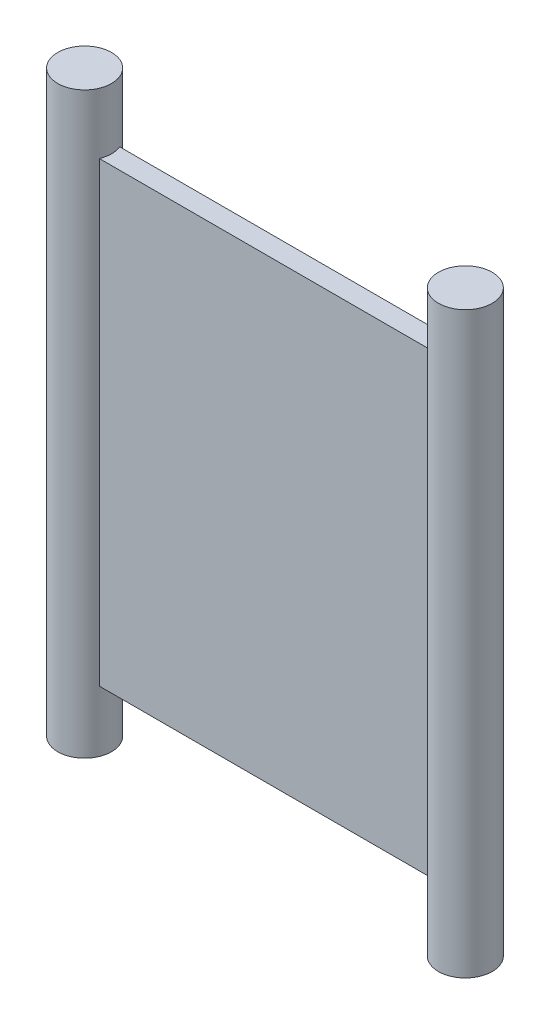
ISO-10303-21;
HEADER;
FILE_DESCRIPTION(('STEP AP214'),'2;1');
FILE_NAME('part.step','',(''),(''),'','','');
FILE_SCHEMA(('AUTOMOTIVE_DESIGN { 1 0 10303 214 1 1 1 1 }'));
ENDSEC;
DATA;
#1=APPLICATION_CONTEXT('core data for automotive mechanical design processes');
#2=APPLICATION_PROTOCOL_DEFINITION('international standard','automotive_design',2000,#1);
#3=PRODUCT_CONTEXT('',#1,'mechanical');
#4=PRODUCT('Part','Part','',(#3));
#5=PRODUCT_RELATED_PRODUCT_CATEGORY('part','',(#4));
#6=PRODUCT_DEFINITION_FORMATION('','',#4);
#7=PRODUCT_DEFINITION_CONTEXT('part definition',#1,'design');
#8=PRODUCT_DEFINITION('design','',#6,#7);
#9=PRODUCT_DEFINITION_SHAPE('','',#8);
#10=(LENGTH_UNIT() NAMED_UNIT(*) SI_UNIT(.MILLI.,.METRE.));
#11=(NAMED_UNIT(*) PLANE_ANGLE_UNIT() SI_UNIT($,.RADIAN.));
#12=(NAMED_UNIT(*) SI_UNIT($,.STERADIAN.) SOLID_ANGLE_UNIT());
#13=UNCERTAINTY_MEASURE_WITH_UNIT(LENGTH_MEASURE(1.E-05),#10,'distance_accuracy_value','');
#14=(GEOMETRIC_REPRESENTATION_CONTEXT(3) GLOBAL_UNCERTAINTY_ASSIGNED_CONTEXT((#13)) GLOBAL_UNIT_ASSIGNED_CONTEXT((#10,
#11,#12)) REPRESENTATION_CONTEXT('',''));
#15=CARTESIAN_POINT('',(0.,0.,0.));
#16=DIRECTION('',(0.,0.,1.));
#17=DIRECTION('',(1.,0.,0.));
#18=AXIS2_PLACEMENT_3D('',#15,#16,#17);
#19=CARTESIAN_POINT('',(9.373,22.5,0.499999999999999));
#20=DIRECTION('',(0.,0.,-1.));
#21=DIRECTION('',(-1.,0.,0.));
#22=AXIS2_PLACEMENT_3D('',#19,#20,#21);
#23=PLANE('',#22);
#24=DIRECTION('',(0.,-1.,0.));
#25=VECTOR('',#24,1.);
#26=CARTESIAN_POINT('',(8.1459608808192,25.5,0.499999999999999));
#27=LINE('',#26,#25);
#28=CARTESIAN_POINT('',(8.1459608808192,22.5,0.499999999999999));
#29=VERTEX_POINT('',#28);
#30=CARTESIAN_POINT('',(8.1459608808192,0.,0.499999999999999));
#31=VERTEX_POINT('',#30);
#32=EDGE_CURVE('E51',#29,#31,#27,.T.);
#33=ORIENTED_EDGE('',*,*,#32,.F.);
#34=DIRECTION('',(1.,0.,0.));
#35=VECTOR('',#34,1.);
#36=CARTESIAN_POINT('',(9.373,22.5,0.499999999999999));
#37=LINE('',#36,#35);
#38=CARTESIAN_POINT('',(-8.1459608808192,22.5,0.500000000000001));
#39=VERTEX_POINT('',#38);
#40=EDGE_CURVE('E88',#39,#29,#37,.T.);
#41=ORIENTED_EDGE('',*,*,#40,.F.);
#42=DIRECTION('',(0.,-1.,0.));
#43=VECTOR('',#42,1.);
#44=CARTESIAN_POINT('',(-8.1459608808192,25.5,0.500000000000001));
#45=LINE('',#44,#43);
#46=CARTESIAN_POINT('',(-8.1459608808192,0.,0.500000000000001));
#47=VERTEX_POINT('',#46);
#48=EDGE_CURVE('E101',#47,#39,#45,.F.);
#49=ORIENTED_EDGE('',*,*,#48,.F.);
#50=DIRECTION('',(1.,0.,0.));
#51=VECTOR('',#50,1.);
#52=CARTESIAN_POINT('',(9.373,0.,0.499999999999999));
#53=LINE('',#52,#51);
#54=EDGE_CURVE('E89',#47,#31,#53,.T.);
#55=ORIENTED_EDGE('',*,*,#54,.T.);
#56=EDGE_LOOP('',(#33,#41,#49,#55));
#57=FACE_BOUND('',#56,.T.);
#58=ADVANCED_FACE('F37',(#57),#23,.F.);
#59=CARTESIAN_POINT('',(9.373,22.5,-0.500000000000001));
#60=DIRECTION('',(0.,0.,1.));
#61=DIRECTION('',(1.,0.,0.));
#62=AXIS2_PLACEMENT_3D('',#59,#60,#61);
#63=PLANE('',#62);
#64=DIRECTION('',(0.,-1.,0.));
#65=VECTOR('',#64,1.);
#66=CARTESIAN_POINT('',(8.1459608808192,25.5,-0.500000000000001));
#67=LINE('',#66,#65);
#68=CARTESIAN_POINT('',(8.1459608808192,0.,-0.500000000000001));
#69=VERTEX_POINT('',#68);
#70=CARTESIAN_POINT('',(8.1459608808192,22.5,-0.500000000000001));
#71=VERTEX_POINT('',#70);
#72=EDGE_CURVE('E76',#69,#71,#67,.F.);
#73=ORIENTED_EDGE('',*,*,#72,.F.);
#74=DIRECTION('',(-1.,0.,0.));
#75=VECTOR('',#74,1.);
#76=CARTESIAN_POINT('',(9.373,0.,-0.500000000000001));
#77=LINE('',#76,#75);
#78=CARTESIAN_POINT('',(-8.14596088081919,0.,-0.499999999999999));
#79=VERTEX_POINT('',#78);
#80=EDGE_CURVE('E58',#69,#79,#77,.T.);
#81=ORIENTED_EDGE('',*,*,#80,.T.);
#82=DIRECTION('',(0.,-1.,0.));
#83=VECTOR('',#82,1.);
#84=CARTESIAN_POINT('',(-8.14596088081919,25.5,-0.499999999999999));
#85=LINE('',#84,#83);
#86=CARTESIAN_POINT('',(-8.14596088081919,22.5,-0.499999999999999));
#87=VERTEX_POINT('',#86);
#88=EDGE_CURVE('E103',#87,#79,#85,.T.);
#89=ORIENTED_EDGE('',*,*,#88,.F.);
#90=DIRECTION('',(-1.,0.,0.));
#91=VECTOR('',#90,1.);
#92=CARTESIAN_POINT('',(9.373,22.5,-0.500000000000001));
#93=LINE('',#92,#91);
#94=EDGE_CURVE('E83',#71,#87,#93,.T.);
#95=ORIENTED_EDGE('',*,*,#94,.F.);
#96=EDGE_LOOP('',(#73,#81,#89,#95));
#97=FACE_BOUND('',#96,.T.);
#98=ADVANCED_FACE('F82',(#97),#63,.F.);
#99=CARTESIAN_POINT('',(-9.373,25.5,0.));
#100=DIRECTION('',(0.,-1.,0.));
#101=DIRECTION('',(0.,0.,-1.));
#102=AXIS2_PLACEMENT_3D('',#99,#100,#101);
#103=CYLINDRICAL_SURFACE('',#102,1.325);
#104=CARTESIAN_POINT('',(-9.373,25.5,0.));
#105=DIRECTION('',(0.,1.,0.));
#106=DIRECTION('',(0.,0.,1.));
#107=AXIS2_PLACEMENT_3D('',#104,#105,#106);
#108=CIRCLE('',#107,1.325);
#109=CARTESIAN_POINT('',(-9.373,25.5,1.325));
#110=VERTEX_POINT('',#109);
#111=EDGE_CURVE('E105',#110,#110,#108,.T.);
#112=ORIENTED_EDGE('',*,*,#111,.F.);
#113=EDGE_LOOP('',(#112));
#114=FACE_BOUND('',#113,.T.);
#115=CARTESIAN_POINT('',(-9.373,-3.,0.));
#116=DIRECTION('',(0.,1.,0.));
#117=DIRECTION('',(0.,0.,1.));
#118=AXIS2_PLACEMENT_3D('',#115,#116,#117);
#119=CIRCLE('',#118,1.325);
#120=CARTESIAN_POINT('',(-9.373,-3.,1.325));
#121=VERTEX_POINT('',#120);
#122=EDGE_CURVE('E106',#121,#121,#119,.T.);
#123=ORIENTED_EDGE('',*,*,#122,.T.);
#124=EDGE_LOOP('',(#123));
#125=FACE_BOUND('',#124,.T.);
#126=ORIENTED_EDGE('',*,*,#48,.T.);
#127=CARTESIAN_POINT('',(-9.373,22.5,0.));
#128=DIRECTION('',(0.,-1.,0.));
#129=DIRECTION('',(0.,0.,-1.));
#130=AXIS2_PLACEMENT_3D('',#127,#128,#129);
#131=CIRCLE('',#130,1.325);
#132=EDGE_CURVE('E93',#39,#87,#131,.F.);
#133=ORIENTED_EDGE('',*,*,#132,.T.);
#134=ORIENTED_EDGE('',*,*,#88,.T.);
#135=CARTESIAN_POINT('',(-9.373,0.,0.));
#136=DIRECTION('',(0.,-1.,0.));
#137=DIRECTION('',(0.,0.,-1.));
#138=AXIS2_PLACEMENT_3D('',#135,#136,#137);
#139=CIRCLE('',#138,1.325);
#140=EDGE_CURVE('E44',#47,#79,#139,.F.);
#141=ORIENTED_EDGE('',*,*,#140,.F.);
#142=EDGE_LOOP('',(#126,#133,#134,#141));
#143=FACE_BOUND('',#142,.T.);
#144=ADVANCED_FACE('F136',(#114,#125,#143),#103,.T.);
#145=CARTESIAN_POINT('',(-9.373,25.5,0.));
#146=DIRECTION('',(0.,1.,0.));
#147=DIRECTION('',(0.,0.,1.));
#148=AXIS2_PLACEMENT_3D('',#145,#146,#147);
#149=PLANE('',#148);
#150=ORIENTED_EDGE('',*,*,#111,.T.);
#151=EDGE_LOOP('',(#150));
#152=FACE_BOUND('',#151,.T.);
#153=ADVANCED_FACE('F142',(#152),#149,.T.);
#154=CARTESIAN_POINT('',(-9.373,-3.,0.));
#155=DIRECTION('',(0.,1.,0.));
#156=DIRECTION('',(0.,0.,1.));
#157=AXIS2_PLACEMENT_3D('',#154,#155,#156);
#158=PLANE('',#157);
#159=ORIENTED_EDGE('',*,*,#122,.F.);
#160=EDGE_LOOP('',(#159));
#161=FACE_BOUND('',#160,.T.);
#162=ADVANCED_FACE('F148',(#161),#158,.F.);
#163=CARTESIAN_POINT('',(0.,22.5,0.));
#164=DIRECTION('',(0.,-1.,0.));
#165=DIRECTION('',(0.,0.,-1.));
#166=AXIS2_PLACEMENT_3D('',#163,#164,#165);
#167=PLANE('',#166);
#168=CARTESIAN_POINT('',(9.373,22.5,0.));
#169=DIRECTION('',(0.,-1.,0.));
#170=DIRECTION('',(0.,0.,-1.));
#171=AXIS2_PLACEMENT_3D('',#168,#169,#170);
#172=CIRCLE('',#171,1.325);
#173=EDGE_CURVE('E109',#71,#29,#172,.F.);
#174=ORIENTED_EDGE('',*,*,#173,.F.);
#175=ORIENTED_EDGE('',*,*,#94,.T.);
#176=ORIENTED_EDGE('',*,*,#132,.F.);
#177=ORIENTED_EDGE('',*,*,#40,.T.);
#178=EDGE_LOOP('',(#174,#175,#176,#177));
#179=FACE_BOUND('',#178,.T.);
#180=ADVANCED_FACE('F139',(#179),#167,.F.);
#181=CARTESIAN_POINT('',(0.,0.,0.));
#182=DIRECTION('',(0.,-1.,0.));
#183=DIRECTION('',(0.,0.,-1.));
#184=AXIS2_PLACEMENT_3D('',#181,#182,#183);
#185=PLANE('',#184);
#186=ORIENTED_EDGE('',*,*,#80,.F.);
#187=CARTESIAN_POINT('',(9.373,0.,0.));
#188=DIRECTION('',(0.,-1.,0.));
#189=DIRECTION('',(0.,0.,-1.));
#190=AXIS2_PLACEMENT_3D('',#187,#188,#189);
#191=CIRCLE('',#190,1.325);
#192=EDGE_CURVE('E11',#69,#31,#191,.F.);
#193=ORIENTED_EDGE('',*,*,#192,.T.);
#194=ORIENTED_EDGE('',*,*,#54,.F.);
#195=ORIENTED_EDGE('',*,*,#140,.T.);
#196=EDGE_LOOP('',(#186,#193,#194,#195));
#197=FACE_BOUND('',#196,.T.);
#198=ADVANCED_FACE('F87',(#197),#185,.T.);
#199=CARTESIAN_POINT('',(9.373,25.5,0.));
#200=DIRECTION('',(0.,-1.,0.));
#201=DIRECTION('',(0.,0.,-1.));
#202=AXIS2_PLACEMENT_3D('',#199,#200,#201);
#203=CYLINDRICAL_SURFACE('',#202,1.325);
#204=CARTESIAN_POINT('',(9.373,25.5,0.));
#205=DIRECTION('',(0.,1.,0.));
#206=DIRECTION('',(0.,0.,1.));
#207=AXIS2_PLACEMENT_3D('',#204,#205,#206);
#208=CIRCLE('',#207,1.325);
#209=CARTESIAN_POINT('',(9.373,25.5,1.325));
#210=VERTEX_POINT('',#209);
#211=EDGE_CURVE('E114',#210,#210,#208,.T.);
#212=ORIENTED_EDGE('',*,*,#211,.F.);
#213=EDGE_LOOP('',(#212));
#214=FACE_BOUND('',#213,.T.);
#215=CARTESIAN_POINT('',(9.373,-3.,0.));
#216=DIRECTION('',(0.,1.,0.));
#217=DIRECTION('',(0.,0.,1.));
#218=AXIS2_PLACEMENT_3D('',#215,#216,#217);
#219=CIRCLE('',#218,1.325);
#220=CARTESIAN_POINT('',(9.373,-3.,1.325));
#221=VERTEX_POINT('',#220);
#222=EDGE_CURVE('E84',#221,#221,#219,.T.);
#223=ORIENTED_EDGE('',*,*,#222,.T.);
#224=EDGE_LOOP('',(#223));
#225=FACE_BOUND('',#224,.T.);
#226=ORIENTED_EDGE('',*,*,#72,.T.);
#227=ORIENTED_EDGE('',*,*,#173,.T.);
#228=ORIENTED_EDGE('',*,*,#32,.T.);
#229=ORIENTED_EDGE('',*,*,#192,.F.);
#230=EDGE_LOOP('',(#226,#227,#228,#229));
#231=FACE_BOUND('',#230,.T.);
#232=ADVANCED_FACE('F75',(#214,#225,#231),#203,.T.);
#233=CARTESIAN_POINT('',(9.373,25.5,0.));
#234=DIRECTION('',(0.,1.,0.));
#235=DIRECTION('',(0.,0.,1.));
#236=AXIS2_PLACEMENT_3D('',#233,#234,#235);
#237=PLANE('',#236);
#238=ORIENTED_EDGE('',*,*,#211,.T.);
#239=EDGE_LOOP('',(#238));
#240=FACE_BOUND('',#239,.T.);
#241=ADVANCED_FACE('F123',(#240),#237,.T.);
#242=CARTESIAN_POINT('',(9.373,-3.,0.));
#243=DIRECTION('',(0.,1.,0.));
#244=DIRECTION('',(0.,0.,1.));
#245=AXIS2_PLACEMENT_3D('',#242,#243,#244);
#246=PLANE('',#245);
#247=ORIENTED_EDGE('',*,*,#222,.F.);
#248=EDGE_LOOP('',(#247));
#249=FACE_BOUND('',#248,.T.);
#250=ADVANCED_FACE('F121',(#249),#246,.F.);
#251=CLOSED_SHELL('',(#58,#98,#144,#153,#162,#180,#198,#232,#241,#250));
#252=MANIFOLD_SOLID_BREP('B2',#251);
#253=ADVANCED_BREP_SHAPE_REPRESENTATION('',(#18,#252),#14);
#254=SHAPE_DEFINITION_REPRESENTATION(#9,#253);
ENDSEC;
END-ISO-10303-21;
